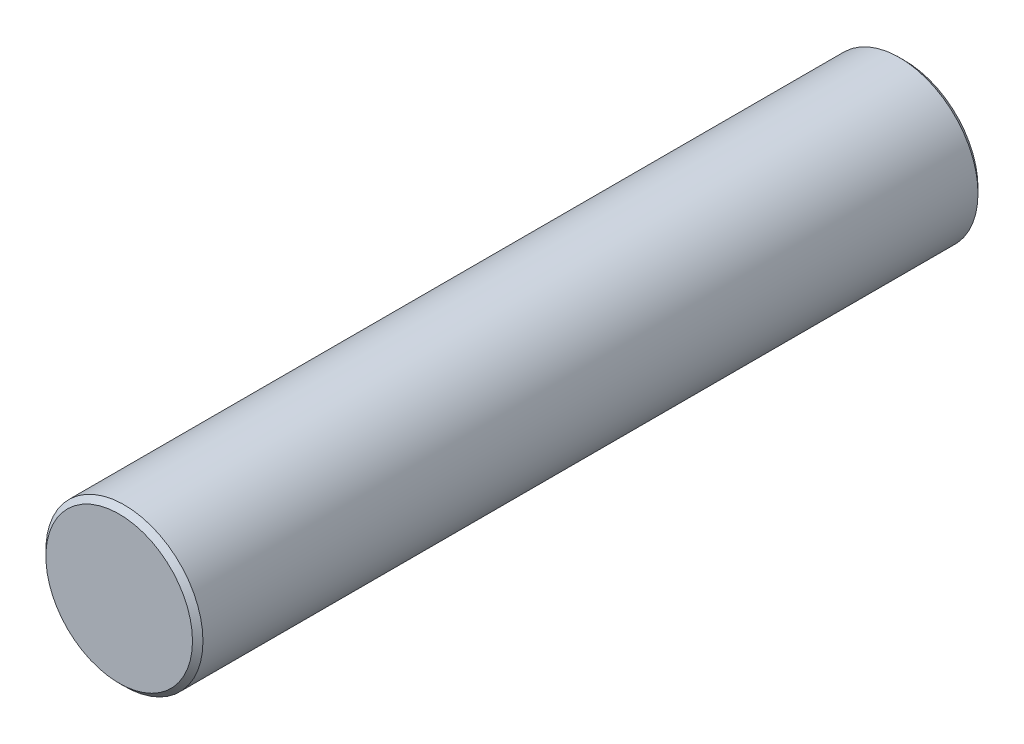
ISO-10303-21;
HEADER;
FILE_DESCRIPTION(('STEP AP214'),'2;1');
FILE_NAME('part.step','',(''),(''),'','','');
FILE_SCHEMA(('AUTOMOTIVE_DESIGN { 1 0 10303 214 1 1 1 1 }'));
ENDSEC;
DATA;
#1=APPLICATION_CONTEXT('core data for automotive mechanical design processes');
#2=APPLICATION_PROTOCOL_DEFINITION('international standard','automotive_design',2000,#1);
#3=PRODUCT_CONTEXT('',#1,'mechanical');
#4=PRODUCT('Part','Part','',(#3));
#5=PRODUCT_RELATED_PRODUCT_CATEGORY('part','',(#4));
#6=PRODUCT_DEFINITION_FORMATION('','',#4);
#7=PRODUCT_DEFINITION_CONTEXT('part definition',#1,'design');
#8=PRODUCT_DEFINITION('design','',#6,#7);
#9=PRODUCT_DEFINITION_SHAPE('','',#8);
#10=(LENGTH_UNIT() NAMED_UNIT(*) SI_UNIT(.MILLI.,.METRE.));
#11=(NAMED_UNIT(*) PLANE_ANGLE_UNIT() SI_UNIT($,.RADIAN.));
#12=(NAMED_UNIT(*) SI_UNIT($,.STERADIAN.) SOLID_ANGLE_UNIT());
#13=UNCERTAINTY_MEASURE_WITH_UNIT(LENGTH_MEASURE(1.E-05),#10,'distance_accuracy_value','');
#14=(GEOMETRIC_REPRESENTATION_CONTEXT(3) GLOBAL_UNCERTAINTY_ASSIGNED_CONTEXT((#13)) GLOBAL_UNIT_ASSIGNED_CONTEXT((#10,
#11,#12)) REPRESENTATION_CONTEXT('',''));
#15=CARTESIAN_POINT('',(0.,0.,0.));
#16=DIRECTION('',(0.,0.,1.));
#17=DIRECTION('',(1.,0.,0.));
#18=AXIS2_PLACEMENT_3D('',#15,#16,#17);
#19=CARTESIAN_POINT('',(0.,0.,15.));
#20=DIRECTION('',(0.,0.,-1.));
#21=DIRECTION('',(-1.,0.,0.));
#22=AXIS2_PLACEMENT_3D('',#19,#20,#21);
#23=CYLINDRICAL_SURFACE('',#22,1.5);
#24=CARTESIAN_POINT('',(0.,0.,14.9));
#25=DIRECTION('',(0.,0.,1.));
#26=DIRECTION('',(1.,0.,0.));
#27=AXIS2_PLACEMENT_3D('',#24,#25,#26);
#28=CIRCLE('',#27,1.5);
#29=CARTESIAN_POINT('',(1.5,0.,14.9));
#30=VERTEX_POINT('',#29);
#31=EDGE_CURVE('E39',#30,#30,#28,.F.);
#32=ORIENTED_EDGE('',*,*,#31,.T.);
#33=EDGE_LOOP('',(#32));
#34=FACE_BOUND('',#33,.T.);
#35=CARTESIAN_POINT('',(0.,0.,0.0999999999999994));
#36=DIRECTION('',(0.,0.,1.));
#37=DIRECTION('',(1.,0.,0.));
#38=AXIS2_PLACEMENT_3D('',#35,#36,#37);
#39=CIRCLE('',#38,1.5);
#40=CARTESIAN_POINT('',(1.5,0.,0.0999999999999994));
#41=VERTEX_POINT('',#40);
#42=EDGE_CURVE('E43',#41,#41,#39,.T.);
#43=ORIENTED_EDGE('',*,*,#42,.T.);
#44=EDGE_LOOP('',(#43));
#45=FACE_BOUND('',#44,.T.);
#46=ADVANCED_FACE('F32',(#34,#45),#23,.T.);
#47=CARTESIAN_POINT('',(0.,0.,15.));
#48=DIRECTION('',(0.,0.,1.));
#49=DIRECTION('',(1.,0.,0.));
#50=AXIS2_PLACEMENT_3D('',#47,#48,#49);
#51=PLANE('',#50);
#52=CARTESIAN_POINT('',(0.,0.,15.));
#53=DIRECTION('',(0.,0.,1.));
#54=DIRECTION('',(1.,0.,0.));
#55=AXIS2_PLACEMENT_3D('',#52,#53,#54);
#56=CIRCLE('',#55,1.4);
#57=CARTESIAN_POINT('',(1.4,0.,15.));
#58=VERTEX_POINT('',#57);
#59=EDGE_CURVE('E47',#58,#58,#56,.T.);
#60=ORIENTED_EDGE('',*,*,#59,.T.);
#61=EDGE_LOOP('',(#60));
#62=FACE_BOUND('',#61,.T.);
#63=ADVANCED_FACE('F53',(#62),#51,.T.);
#64=CARTESIAN_POINT('',(0.,0.,0.));
#65=DIRECTION('',(0.,0.,1.));
#66=DIRECTION('',(1.,0.,0.));
#67=AXIS2_PLACEMENT_3D('',#64,#65,#66);
#68=PLANE('',#67);
#69=CARTESIAN_POINT('',(0.,0.,0.));
#70=DIRECTION('',(0.,0.,1.));
#71=DIRECTION('',(1.,0.,0.));
#72=AXIS2_PLACEMENT_3D('',#69,#70,#71);
#73=CIRCLE('',#72,1.4);
#74=CARTESIAN_POINT('',(1.4,0.,0.));
#75=VERTEX_POINT('',#74);
#76=EDGE_CURVE('E10',#75,#75,#73,.F.);
#77=ORIENTED_EDGE('',*,*,#76,.T.);
#78=EDGE_LOOP('',(#77));
#79=FACE_BOUND('',#78,.T.);
#80=ADVANCED_FACE('F57',(#79),#68,.F.);
#81=CARTESIAN_POINT('',(0.,0.,15.));
#82=DIRECTION('',(0.,0.,-1.));
#83=DIRECTION('',(-1.,0.,0.));
#84=AXIS2_PLACEMENT_3D('',#81,#82,#83);
#85=CONICAL_SURFACE('',#84,1.4,0.785398163397448);
#86=ORIENTED_EDGE('',*,*,#31,.F.);
#87=EDGE_LOOP('',(#86));
#88=FACE_BOUND('',#87,.T.);
#89=ORIENTED_EDGE('',*,*,#59,.F.);
#90=EDGE_LOOP('',(#89));
#91=FACE_BOUND('',#90,.T.);
#92=ADVANCED_FACE('F55',(#88,#91),#85,.T.);
#93=CARTESIAN_POINT('',(0.,0.,0.0999999999999994));
#94=DIRECTION('',(0.,0.,1.));
#95=DIRECTION('',(1.,0.,0.));
#96=AXIS2_PLACEMENT_3D('',#93,#94,#95);
#97=CONICAL_SURFACE('',#96,1.5,0.785398163397448);
#98=ORIENTED_EDGE('',*,*,#76,.F.);
#99=EDGE_LOOP('',(#98));
#100=FACE_BOUND('',#99,.T.);
#101=ORIENTED_EDGE('',*,*,#42,.F.);
#102=EDGE_LOOP('',(#101));
#103=FACE_BOUND('',#102,.T.);
#104=ADVANCED_FACE('F34',(#100,#103),#97,.T.);
#105=CLOSED_SHELL('',(#46,#63,#80,#92,#104));
#106=MANIFOLD_SOLID_BREP('B2',#105);
#107=ADVANCED_BREP_SHAPE_REPRESENTATION('',(#18,#106),#14);
#108=SHAPE_DEFINITION_REPRESENTATION(#9,#107);
ENDSEC;
END-ISO-10303-21;
